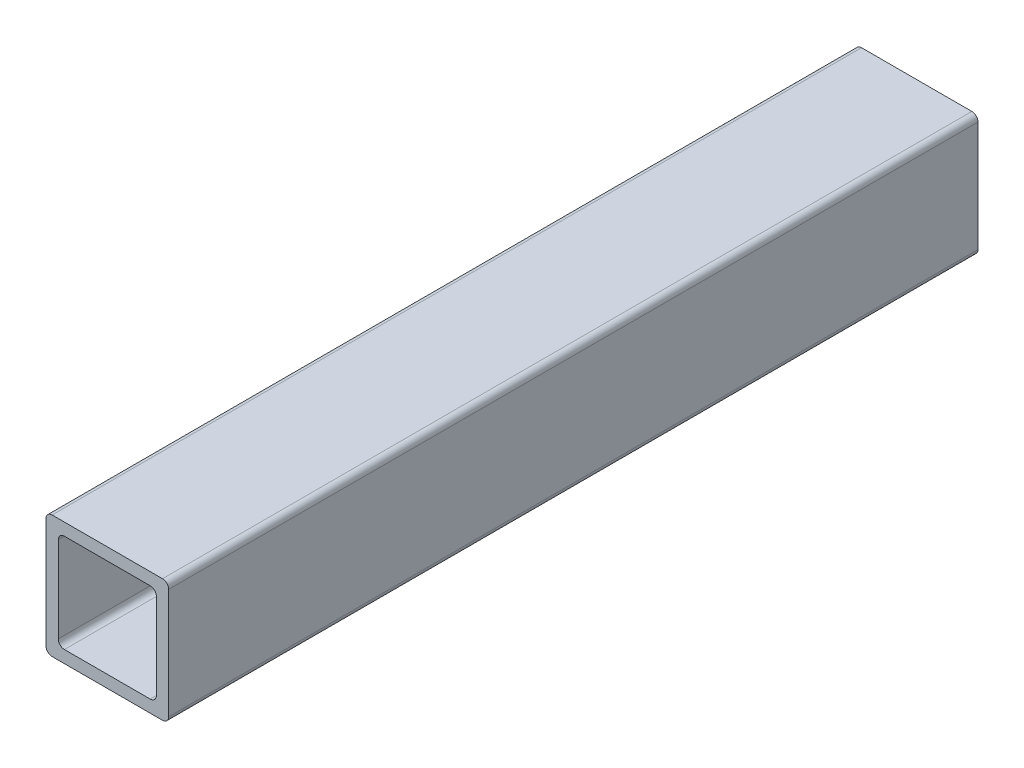
ISO-10303-21;
HEADER;
FILE_DESCRIPTION(('STEP AP214'),'2;1');
FILE_NAME('part.step','',(''),(''),'','','');
FILE_SCHEMA(('AUTOMOTIVE_DESIGN { 1 0 10303 214 1 1 1 1 }'));
ENDSEC;
DATA;
#1=APPLICATION_CONTEXT('core data for automotive mechanical design processes');
#2=APPLICATION_PROTOCOL_DEFINITION('international standard','automotive_design',2000,#1);
#3=PRODUCT_CONTEXT('',#1,'mechanical');
#4=PRODUCT('Part','Part','',(#3));
#5=PRODUCT_RELATED_PRODUCT_CATEGORY('part','',(#4));
#6=PRODUCT_DEFINITION_FORMATION('','',#4);
#7=PRODUCT_DEFINITION_CONTEXT('part definition',#1,'design');
#8=PRODUCT_DEFINITION('design','',#6,#7);
#9=PRODUCT_DEFINITION_SHAPE('','',#8);
#10=(LENGTH_UNIT() NAMED_UNIT(*) SI_UNIT(.MILLI.,.METRE.));
#11=(NAMED_UNIT(*) PLANE_ANGLE_UNIT() SI_UNIT($,.RADIAN.));
#12=(NAMED_UNIT(*) SI_UNIT($,.STERADIAN.) SOLID_ANGLE_UNIT());
#13=UNCERTAINTY_MEASURE_WITH_UNIT(LENGTH_MEASURE(1.E-05),#10,'distance_accuracy_value','');
#14=(GEOMETRIC_REPRESENTATION_CONTEXT(3) GLOBAL_UNCERTAINTY_ASSIGNED_CONTEXT((#13)) GLOBAL_UNIT_ASSIGNED_CONTEXT((#10,
#11,#12)) REPRESENTATION_CONTEXT('',''));
#15=CARTESIAN_POINT('',(0.,0.,0.));
#16=DIRECTION('',(0.,0.,1.));
#17=DIRECTION('',(1.,0.,0.));
#18=AXIS2_PLACEMENT_3D('',#15,#16,#17);
#19=CARTESIAN_POINT('',(2.,2.,264.));
#20=DIRECTION('',(0.,0.,-1.));
#21=DIRECTION('',(-1.,0.,0.));
#22=AXIS2_PLACEMENT_3D('',#19,#20,#21);
#23=PLANE('',#22);
#24=CARTESIAN_POINT('',(2.,2.,264.));
#25=DIRECTION('',(0.,0.,1.));
#26=DIRECTION('',(-1.,0.,0.));
#27=AXIS2_PLACEMENT_3D('',#24,#25,#26);
#28=CIRCLE('',#27,2.);
#29=CARTESIAN_POINT('',(0.,2.00000000000001,264.));
#30=VERTEX_POINT('',#29);
#31=CARTESIAN_POINT('',(2.00000000000001,0.,264.));
#32=VERTEX_POINT('',#31);
#33=EDGE_CURVE('E211',#30,#32,#28,.T.);
#34=ORIENTED_EDGE('',*,*,#33,.T.);
#35=DIRECTION('',(1.,0.,0.));
#36=VECTOR('',#35,1.);
#37=CARTESIAN_POINT('',(2.00000000000001,0.,264.));
#38=LINE('',#37,#36);
#39=CARTESIAN_POINT('',(38.,0.,264.));
#40=VERTEX_POINT('',#39);
#41=EDGE_CURVE('E214',#32,#40,#38,.T.);
#42=ORIENTED_EDGE('',*,*,#41,.T.);
#43=CARTESIAN_POINT('',(38.,2.,264.));
#44=DIRECTION('',(0.,0.,1.));
#45=DIRECTION('',(-1.,0.,0.));
#46=AXIS2_PLACEMENT_3D('',#43,#44,#45);
#47=CIRCLE('',#46,2.);
#48=CARTESIAN_POINT('',(40.,2.00000000000001,264.));
#49=VERTEX_POINT('',#48);
#50=EDGE_CURVE('E217',#40,#49,#47,.T.);
#51=ORIENTED_EDGE('',*,*,#50,.T.);
#52=DIRECTION('',(0.,1.,0.));
#53=VECTOR('',#52,1.);
#54=CARTESIAN_POINT('',(40.,2.00000000000001,264.));
#55=LINE('',#54,#53);
#56=CARTESIAN_POINT('',(40.,38.,264.));
#57=VERTEX_POINT('',#56);
#58=EDGE_CURVE('E219',#49,#57,#55,.T.);
#59=ORIENTED_EDGE('',*,*,#58,.T.);
#60=CARTESIAN_POINT('',(38.,38.,264.));
#61=DIRECTION('',(0.,0.,1.));
#62=DIRECTION('',(-1.,0.,0.));
#63=AXIS2_PLACEMENT_3D('',#60,#61,#62);
#64=CIRCLE('',#63,2.);
#65=CARTESIAN_POINT('',(38.,40.,264.));
#66=VERTEX_POINT('',#65);
#67=EDGE_CURVE('E221',#57,#66,#64,.T.);
#68=ORIENTED_EDGE('',*,*,#67,.T.);
#69=DIRECTION('',(-1.,0.,0.));
#70=VECTOR('',#69,1.);
#71=CARTESIAN_POINT('',(2.00000000000001,40.,264.));
#72=LINE('',#71,#70);
#73=CARTESIAN_POINT('',(2.00000000000001,40.,264.));
#74=VERTEX_POINT('',#73);
#75=EDGE_CURVE('E223',#66,#74,#72,.T.);
#76=ORIENTED_EDGE('',*,*,#75,.T.);
#77=CARTESIAN_POINT('',(2.,38.,264.));
#78=DIRECTION('',(0.,0.,1.));
#79=DIRECTION('',(-1.,0.,0.));
#80=AXIS2_PLACEMENT_3D('',#77,#78,#79);
#81=CIRCLE('',#80,2.);
#82=CARTESIAN_POINT('',(0.,38.,264.));
#83=VERTEX_POINT('',#82);
#84=EDGE_CURVE('E225',#74,#83,#81,.T.);
#85=ORIENTED_EDGE('',*,*,#84,.T.);
#86=DIRECTION('',(0.,-1.,0.));
#87=VECTOR('',#86,1.);
#88=CARTESIAN_POINT('',(0.,2.00000000000001,264.));
#89=LINE('',#88,#87);
#90=EDGE_CURVE('E227',#83,#30,#89,.T.);
#91=ORIENTED_EDGE('',*,*,#90,.T.);
#92=EDGE_LOOP('',(#34,#42,#51,#59,#68,#76,#85,#91));
#93=FACE_BOUND('',#92,.T.);
#94=CARTESIAN_POINT('',(34.,6.,264.));
#95=DIRECTION('',(0.,0.,1.));
#96=DIRECTION('',(1.,0.,0.));
#97=AXIS2_PLACEMENT_3D('',#94,#95,#96);
#98=CIRCLE('',#97,2.);
#99=CARTESIAN_POINT('',(34.,4.,264.));
#100=VERTEX_POINT('',#99);
#101=CARTESIAN_POINT('',(36.,6.00000000000001,264.));
#102=VERTEX_POINT('',#101);
#103=EDGE_CURVE('E146',#100,#102,#98,.T.);
#104=ORIENTED_EDGE('',*,*,#103,.F.);
#105=DIRECTION('',(1.,0.,0.));
#106=VECTOR('',#105,1.);
#107=CARTESIAN_POINT('',(6.00000000000001,4.,264.));
#108=LINE('',#107,#106);
#109=CARTESIAN_POINT('',(6.00000000000001,4.,264.));
#110=VERTEX_POINT('',#109);
#111=EDGE_CURVE('E179',#110,#100,#108,.T.);
#112=ORIENTED_EDGE('',*,*,#111,.F.);
#113=CARTESIAN_POINT('',(6.,6.,264.));
#114=DIRECTION('',(0.,0.,1.));
#115=DIRECTION('',(1.,0.,0.));
#116=AXIS2_PLACEMENT_3D('',#113,#114,#115);
#117=CIRCLE('',#116,2.);
#118=CARTESIAN_POINT('',(4.,6.00000000000001,264.));
#119=VERTEX_POINT('',#118);
#120=EDGE_CURVE('E177',#119,#110,#117,.T.);
#121=ORIENTED_EDGE('',*,*,#120,.F.);
#122=DIRECTION('',(0.,-1.,0.));
#123=VECTOR('',#122,1.);
#124=CARTESIAN_POINT('',(4.,6.00000000000001,264.));
#125=LINE('',#124,#123);
#126=CARTESIAN_POINT('',(4.,34.,264.));
#127=VERTEX_POINT('',#126);
#128=EDGE_CURVE('E175',#127,#119,#125,.T.);
#129=ORIENTED_EDGE('',*,*,#128,.F.);
#130=CARTESIAN_POINT('',(6.,34.,264.));
#131=DIRECTION('',(0.,0.,1.));
#132=DIRECTION('',(1.,0.,0.));
#133=AXIS2_PLACEMENT_3D('',#130,#131,#132);
#134=CIRCLE('',#133,2.);
#135=CARTESIAN_POINT('',(6.00000000000001,36.,264.));
#136=VERTEX_POINT('',#135);
#137=EDGE_CURVE('E173',#136,#127,#134,.T.);
#138=ORIENTED_EDGE('',*,*,#137,.F.);
#139=DIRECTION('',(-1.,0.,0.));
#140=VECTOR('',#139,1.);
#141=CARTESIAN_POINT('',(6.00000000000001,36.,264.));
#142=LINE('',#141,#140);
#143=CARTESIAN_POINT('',(34.,36.,264.));
#144=VERTEX_POINT('',#143);
#145=EDGE_CURVE('E169',#144,#136,#142,.T.);
#146=ORIENTED_EDGE('',*,*,#145,.F.);
#147=CARTESIAN_POINT('',(34.,34.,264.));
#148=DIRECTION('',(0.,0.,1.));
#149=DIRECTION('',(1.,0.,0.));
#150=AXIS2_PLACEMENT_3D('',#147,#148,#149);
#151=CIRCLE('',#150,2.);
#152=CARTESIAN_POINT('',(36.,34.,264.));
#153=VERTEX_POINT('',#152);
#154=EDGE_CURVE('E167',#153,#144,#151,.T.);
#155=ORIENTED_EDGE('',*,*,#154,.F.);
#156=DIRECTION('',(0.,1.,0.));
#157=VECTOR('',#156,1.);
#158=CARTESIAN_POINT('',(36.,6.00000000000001,264.));
#159=LINE('',#158,#157);
#160=EDGE_CURVE('E154',#102,#153,#159,.T.);
#161=ORIENTED_EDGE('',*,*,#160,.F.);
#162=EDGE_LOOP('',(#104,#112,#121,#129,#138,#146,#155,#161));
#163=FACE_BOUND('',#162,.T.);
#164=ADVANCED_FACE('F33',(#93,#163),#23,.F.);
#165=CARTESIAN_POINT('',(2.,2.,0.));
#166=DIRECTION('',(0.,0.,-1.));
#167=DIRECTION('',(-1.,0.,0.));
#168=AXIS2_PLACEMENT_3D('',#165,#166,#167);
#169=PLANE('',#168);
#170=CARTESIAN_POINT('',(2.,2.,0.));
#171=DIRECTION('',(0.,0.,1.));
#172=DIRECTION('',(-1.,0.,0.));
#173=AXIS2_PLACEMENT_3D('',#170,#171,#172);
#174=CIRCLE('',#173,2.);
#175=CARTESIAN_POINT('',(0.,2.00000000000001,0.));
#176=VERTEX_POINT('',#175);
#177=CARTESIAN_POINT('',(2.00000000000001,0.,0.));
#178=VERTEX_POINT('',#177);
#179=EDGE_CURVE('E162',#176,#178,#174,.T.);
#180=ORIENTED_EDGE('',*,*,#179,.F.);
#181=DIRECTION('',(0.,-1.,0.));
#182=VECTOR('',#181,1.);
#183=CARTESIAN_POINT('',(0.,2.00000000000001,0.));
#184=LINE('',#183,#182);
#185=CARTESIAN_POINT('',(0.,38.,0.));
#186=VERTEX_POINT('',#185);
#187=EDGE_CURVE('E215',#186,#176,#184,.T.);
#188=ORIENTED_EDGE('',*,*,#187,.F.);
#189=CARTESIAN_POINT('',(2.,38.,0.));
#190=DIRECTION('',(0.,0.,1.));
#191=DIRECTION('',(-1.,0.,0.));
#192=AXIS2_PLACEMENT_3D('',#189,#190,#191);
#193=CIRCLE('',#192,2.);
#194=CARTESIAN_POINT('',(2.00000000000001,40.,0.));
#195=VERTEX_POINT('',#194);
#196=EDGE_CURVE('E242',#195,#186,#193,.T.);
#197=ORIENTED_EDGE('',*,*,#196,.F.);
#198=DIRECTION('',(-1.,0.,0.));
#199=VECTOR('',#198,1.);
#200=CARTESIAN_POINT('',(2.00000000000001,40.,0.));
#201=LINE('',#200,#199);
#202=CARTESIAN_POINT('',(38.,40.,0.));
#203=VERTEX_POINT('',#202);
#204=EDGE_CURVE('E240',#203,#195,#201,.T.);
#205=ORIENTED_EDGE('',*,*,#204,.F.);
#206=CARTESIAN_POINT('',(38.,38.,0.));
#207=DIRECTION('',(0.,0.,1.));
#208=DIRECTION('',(-1.,0.,0.));
#209=AXIS2_PLACEMENT_3D('',#206,#207,#208);
#210=CIRCLE('',#209,2.);
#211=CARTESIAN_POINT('',(40.,38.,0.));
#212=VERTEX_POINT('',#211);
#213=EDGE_CURVE('E238',#212,#203,#210,.T.);
#214=ORIENTED_EDGE('',*,*,#213,.F.);
#215=DIRECTION('',(0.,1.,0.));
#216=VECTOR('',#215,1.);
#217=CARTESIAN_POINT('',(40.,2.00000000000001,0.));
#218=LINE('',#217,#216);
#219=CARTESIAN_POINT('',(40.,2.00000000000001,0.));
#220=VERTEX_POINT('',#219);
#221=EDGE_CURVE('E236',#220,#212,#218,.T.);
#222=ORIENTED_EDGE('',*,*,#221,.F.);
#223=CARTESIAN_POINT('',(38.,2.,0.));
#224=DIRECTION('',(0.,0.,1.));
#225=DIRECTION('',(-1.,0.,0.));
#226=AXIS2_PLACEMENT_3D('',#223,#224,#225);
#227=CIRCLE('',#226,2.);
#228=CARTESIAN_POINT('',(38.,0.,0.));
#229=VERTEX_POINT('',#228);
#230=EDGE_CURVE('E234',#229,#220,#227,.T.);
#231=ORIENTED_EDGE('',*,*,#230,.F.);
#232=DIRECTION('',(1.,0.,0.));
#233=VECTOR('',#232,1.);
#234=CARTESIAN_POINT('',(2.00000000000001,0.,0.));
#235=LINE('',#234,#233);
#236=EDGE_CURVE('E232',#178,#229,#235,.T.);
#237=ORIENTED_EDGE('',*,*,#236,.F.);
#238=EDGE_LOOP('',(#180,#188,#197,#205,#214,#222,#231,#237));
#239=FACE_BOUND('',#238,.T.);
#240=DIRECTION('',(1.,0.,0.));
#241=VECTOR('',#240,1.);
#242=CARTESIAN_POINT('',(6.00000000000001,4.,0.));
#243=LINE('',#242,#241);
#244=CARTESIAN_POINT('',(6.00000000000001,4.,0.));
#245=VERTEX_POINT('',#244);
#246=CARTESIAN_POINT('',(34.,4.,0.));
#247=VERTEX_POINT('',#246);
#248=EDGE_CURVE('E155',#245,#247,#243,.T.);
#249=ORIENTED_EDGE('',*,*,#248,.T.);
#250=CARTESIAN_POINT('',(34.,6.,0.));
#251=DIRECTION('',(0.,0.,1.));
#252=DIRECTION('',(1.,0.,0.));
#253=AXIS2_PLACEMENT_3D('',#250,#251,#252);
#254=CIRCLE('',#253,2.);
#255=CARTESIAN_POINT('',(36.,6.00000000000001,0.));
#256=VERTEX_POINT('',#255);
#257=EDGE_CURVE('E56',#247,#256,#254,.T.);
#258=ORIENTED_EDGE('',*,*,#257,.T.);
#259=DIRECTION('',(0.,1.,0.));
#260=VECTOR('',#259,1.);
#261=CARTESIAN_POINT('',(36.,6.00000000000001,0.));
#262=LINE('',#261,#260);
#263=CARTESIAN_POINT('',(36.,34.,0.));
#264=VERTEX_POINT('',#263);
#265=EDGE_CURVE('E161',#256,#264,#262,.T.);
#266=ORIENTED_EDGE('',*,*,#265,.T.);
#267=CARTESIAN_POINT('',(34.,34.,0.));
#268=DIRECTION('',(0.,0.,1.));
#269=DIRECTION('',(1.,0.,0.));
#270=AXIS2_PLACEMENT_3D('',#267,#268,#269);
#271=CIRCLE('',#270,2.);
#272=CARTESIAN_POINT('',(34.,36.,0.));
#273=VERTEX_POINT('',#272);
#274=EDGE_CURVE('E183',#264,#273,#271,.T.);
#275=ORIENTED_EDGE('',*,*,#274,.T.);
#276=DIRECTION('',(-1.,0.,0.));
#277=VECTOR('',#276,1.);
#278=CARTESIAN_POINT('',(6.00000000000001,36.,0.));
#279=LINE('',#278,#277);
#280=CARTESIAN_POINT('',(6.00000000000001,36.,0.));
#281=VERTEX_POINT('',#280);
#282=EDGE_CURVE('E186',#273,#281,#279,.T.);
#283=ORIENTED_EDGE('',*,*,#282,.T.);
#284=CARTESIAN_POINT('',(6.,34.,0.));
#285=DIRECTION('',(0.,0.,1.));
#286=DIRECTION('',(1.,0.,0.));
#287=AXIS2_PLACEMENT_3D('',#284,#285,#286);
#288=CIRCLE('',#287,2.);
#289=CARTESIAN_POINT('',(4.,34.,0.));
#290=VERTEX_POINT('',#289);
#291=EDGE_CURVE('E189',#281,#290,#288,.T.);
#292=ORIENTED_EDGE('',*,*,#291,.T.);
#293=DIRECTION('',(0.,-1.,0.));
#294=VECTOR('',#293,1.);
#295=CARTESIAN_POINT('',(4.,6.00000000000001,0.));
#296=LINE('',#295,#294);
#297=CARTESIAN_POINT('',(4.,6.00000000000001,0.));
#298=VERTEX_POINT('',#297);
#299=EDGE_CURVE('E192',#290,#298,#296,.T.);
#300=ORIENTED_EDGE('',*,*,#299,.T.);
#301=CARTESIAN_POINT('',(6.,6.,0.));
#302=DIRECTION('',(0.,0.,1.));
#303=DIRECTION('',(1.,0.,0.));
#304=AXIS2_PLACEMENT_3D('',#301,#302,#303);
#305=CIRCLE('',#304,2.);
#306=EDGE_CURVE('E195',#298,#245,#305,.T.);
#307=ORIENTED_EDGE('',*,*,#306,.T.);
#308=EDGE_LOOP('',(#249,#258,#266,#275,#283,#292,#300,#307));
#309=FACE_BOUND('',#308,.T.);
#310=ADVANCED_FACE('F272',(#239,#309),#169,.T.);
#311=CARTESIAN_POINT('',(2.,2.,264.));
#312=DIRECTION('',(0.,0.,-1.));
#313=DIRECTION('',(-1.,0.,0.));
#314=AXIS2_PLACEMENT_3D('',#311,#312,#313);
#315=CYLINDRICAL_SURFACE('',#314,2.);
#316=ORIENTED_EDGE('',*,*,#179,.T.);
#317=DIRECTION('',(0.,0.,-1.));
#318=VECTOR('',#317,1.);
#319=CARTESIAN_POINT('',(2.00000000000001,0.,264.));
#320=LINE('',#319,#318);
#321=EDGE_CURVE('E11',#32,#178,#320,.T.);
#322=ORIENTED_EDGE('',*,*,#321,.F.);
#323=ORIENTED_EDGE('',*,*,#33,.F.);
#324=DIRECTION('',(0.,0.,-1.));
#325=VECTOR('',#324,1.);
#326=CARTESIAN_POINT('',(0.,2.00000000000001,264.));
#327=LINE('',#326,#325);
#328=EDGE_CURVE('E229',#30,#176,#327,.T.);
#329=ORIENTED_EDGE('',*,*,#328,.T.);
#330=EDGE_LOOP('',(#316,#322,#323,#329));
#331=FACE_BOUND('',#330,.T.);
#332=ADVANCED_FACE('F35',(#331),#315,.T.);
#333=CARTESIAN_POINT('',(2.00000000000001,0.,264.));
#334=DIRECTION('',(0.,1.,0.));
#335=DIRECTION('',(0.,0.,1.));
#336=AXIS2_PLACEMENT_3D('',#333,#334,#335);
#337=PLANE('',#336);
#338=ORIENTED_EDGE('',*,*,#236,.T.);
#339=DIRECTION('',(0.,0.,-1.));
#340=VECTOR('',#339,1.);
#341=CARTESIAN_POINT('',(38.,0.,264.));
#342=LINE('',#341,#340);
#343=EDGE_CURVE('E41',#40,#229,#342,.T.);
#344=ORIENTED_EDGE('',*,*,#343,.F.);
#345=ORIENTED_EDGE('',*,*,#41,.F.);
#346=ORIENTED_EDGE('',*,*,#321,.T.);
#347=EDGE_LOOP('',(#338,#344,#345,#346));
#348=FACE_BOUND('',#347,.T.);
#349=ADVANCED_FACE('F289',(#348),#337,.F.);
#350=CARTESIAN_POINT('',(38.,2.,264.));
#351=DIRECTION('',(0.,0.,-1.));
#352=DIRECTION('',(-1.,0.,0.));
#353=AXIS2_PLACEMENT_3D('',#350,#351,#352);
#354=CYLINDRICAL_SURFACE('',#353,2.);
#355=ORIENTED_EDGE('',*,*,#230,.T.);
#356=DIRECTION('',(0.,0.,-1.));
#357=VECTOR('',#356,1.);
#358=CARTESIAN_POINT('',(40.,2.00000000000001,264.));
#359=LINE('',#358,#357);
#360=EDGE_CURVE('E259',#49,#220,#359,.T.);
#361=ORIENTED_EDGE('',*,*,#360,.F.);
#362=ORIENTED_EDGE('',*,*,#50,.F.);
#363=ORIENTED_EDGE('',*,*,#343,.T.);
#364=EDGE_LOOP('',(#355,#361,#362,#363));
#365=FACE_BOUND('',#364,.T.);
#366=ADVANCED_FACE('F266',(#365),#354,.T.);
#367=CARTESIAN_POINT('',(40.,2.00000000000001,264.));
#368=DIRECTION('',(-1.,0.,0.));
#369=DIRECTION('',(0.,0.,1.));
#370=AXIS2_PLACEMENT_3D('',#367,#368,#369);
#371=PLANE('',#370);
#372=ORIENTED_EDGE('',*,*,#221,.T.);
#373=DIRECTION('',(0.,0.,-1.));
#374=VECTOR('',#373,1.);
#375=CARTESIAN_POINT('',(40.,38.,264.));
#376=LINE('',#375,#374);
#377=EDGE_CURVE('E256',#57,#212,#376,.T.);
#378=ORIENTED_EDGE('',*,*,#377,.F.);
#379=ORIENTED_EDGE('',*,*,#58,.F.);
#380=ORIENTED_EDGE('',*,*,#360,.T.);
#381=EDGE_LOOP('',(#372,#378,#379,#380));
#382=FACE_BOUND('',#381,.T.);
#383=ADVANCED_FACE('F278',(#382),#371,.F.);
#384=CARTESIAN_POINT('',(38.,38.,264.));
#385=DIRECTION('',(0.,0.,-1.));
#386=DIRECTION('',(-1.,0.,0.));
#387=AXIS2_PLACEMENT_3D('',#384,#385,#386);
#388=CYLINDRICAL_SURFACE('',#387,2.);
#389=ORIENTED_EDGE('',*,*,#213,.T.);
#390=DIRECTION('',(0.,0.,-1.));
#391=VECTOR('',#390,1.);
#392=CARTESIAN_POINT('',(38.,40.,264.));
#393=LINE('',#392,#391);
#394=EDGE_CURVE('E253',#66,#203,#393,.T.);
#395=ORIENTED_EDGE('',*,*,#394,.F.);
#396=ORIENTED_EDGE('',*,*,#67,.F.);
#397=ORIENTED_EDGE('',*,*,#377,.T.);
#398=EDGE_LOOP('',(#389,#395,#396,#397));
#399=FACE_BOUND('',#398,.T.);
#400=ADVANCED_FACE('F282',(#399),#388,.T.);
#401=CARTESIAN_POINT('',(2.00000000000001,40.,264.));
#402=DIRECTION('',(0.,-1.,0.));
#403=DIRECTION('',(0.,0.,-1.));
#404=AXIS2_PLACEMENT_3D('',#401,#402,#403);
#405=PLANE('',#404);
#406=ORIENTED_EDGE('',*,*,#204,.T.);
#407=DIRECTION('',(0.,0.,-1.));
#408=VECTOR('',#407,1.);
#409=CARTESIAN_POINT('',(2.00000000000001,40.,264.));
#410=LINE('',#409,#408);
#411=EDGE_CURVE('E250',#74,#195,#410,.T.);
#412=ORIENTED_EDGE('',*,*,#411,.F.);
#413=ORIENTED_EDGE('',*,*,#75,.F.);
#414=ORIENTED_EDGE('',*,*,#394,.T.);
#415=EDGE_LOOP('',(#406,#412,#413,#414));
#416=FACE_BOUND('',#415,.T.);
#417=ADVANCED_FACE('F302',(#416),#405,.F.);
#418=CARTESIAN_POINT('',(2.,38.,264.));
#419=DIRECTION('',(0.,0.,-1.));
#420=DIRECTION('',(-1.,0.,0.));
#421=AXIS2_PLACEMENT_3D('',#418,#419,#420);
#422=CYLINDRICAL_SURFACE('',#421,2.);
#423=ORIENTED_EDGE('',*,*,#196,.T.);
#424=DIRECTION('',(0.,0.,-1.));
#425=VECTOR('',#424,1.);
#426=CARTESIAN_POINT('',(0.,38.,264.));
#427=LINE('',#426,#425);
#428=EDGE_CURVE('E247',#83,#186,#427,.T.);
#429=ORIENTED_EDGE('',*,*,#428,.F.);
#430=ORIENTED_EDGE('',*,*,#84,.F.);
#431=ORIENTED_EDGE('',*,*,#411,.T.);
#432=EDGE_LOOP('',(#423,#429,#430,#431));
#433=FACE_BOUND('',#432,.T.);
#434=ADVANCED_FACE('F300',(#433),#422,.T.);
#435=CARTESIAN_POINT('',(0.,2.00000000000001,264.));
#436=DIRECTION('',(1.,0.,0.));
#437=DIRECTION('',(0.,0.,-1.));
#438=AXIS2_PLACEMENT_3D('',#435,#436,#437);
#439=PLANE('',#438);
#440=ORIENTED_EDGE('',*,*,#187,.T.);
#441=ORIENTED_EDGE('',*,*,#328,.F.);
#442=ORIENTED_EDGE('',*,*,#90,.F.);
#443=ORIENTED_EDGE('',*,*,#428,.T.);
#444=EDGE_LOOP('',(#440,#441,#442,#443));
#445=FACE_BOUND('',#444,.T.);
#446=ADVANCED_FACE('F295',(#445),#439,.F.);
#447=CARTESIAN_POINT('',(34.,6.,264.));
#448=DIRECTION('',(0.,0.,-1.));
#449=DIRECTION('',(-1.,0.,0.));
#450=AXIS2_PLACEMENT_3D('',#447,#448,#449);
#451=CYLINDRICAL_SURFACE('',#450,2.);
#452=ORIENTED_EDGE('',*,*,#257,.F.);
#453=DIRECTION('',(0.,0.,-1.));
#454=VECTOR('',#453,1.);
#455=CARTESIAN_POINT('',(34.,4.,264.));
#456=LINE('',#455,#454);
#457=EDGE_CURVE('E150',#100,#247,#456,.T.);
#458=ORIENTED_EDGE('',*,*,#457,.F.);
#459=ORIENTED_EDGE('',*,*,#103,.T.);
#460=DIRECTION('',(0.,0.,-1.));
#461=VECTOR('',#460,1.);
#462=CARTESIAN_POINT('',(36.,6.00000000000001,264.));
#463=LINE('',#462,#461);
#464=EDGE_CURVE('E149',#102,#256,#463,.T.);
#465=ORIENTED_EDGE('',*,*,#464,.T.);
#466=EDGE_LOOP('',(#452,#458,#459,#465));
#467=FACE_BOUND('',#466,.T.);
#468=ADVANCED_FACE('F148',(#467),#451,.F.);
#469=CARTESIAN_POINT('',(36.,6.00000000000001,264.));
#470=DIRECTION('',(-1.,0.,0.));
#471=DIRECTION('',(0.,0.,1.));
#472=AXIS2_PLACEMENT_3D('',#469,#470,#471);
#473=PLANE('',#472);
#474=ORIENTED_EDGE('',*,*,#265,.F.);
#475=ORIENTED_EDGE('',*,*,#464,.F.);
#476=ORIENTED_EDGE('',*,*,#160,.T.);
#477=DIRECTION('',(0.,0.,-1.));
#478=VECTOR('',#477,1.);
#479=CARTESIAN_POINT('',(36.,34.,264.));
#480=LINE('',#479,#478);
#481=EDGE_CURVE('E163',#153,#264,#480,.T.);
#482=ORIENTED_EDGE('',*,*,#481,.T.);
#483=EDGE_LOOP('',(#474,#475,#476,#482));
#484=FACE_BOUND('',#483,.T.);
#485=ADVANCED_FACE('F158',(#484),#473,.T.);
#486=CARTESIAN_POINT('',(34.,34.,264.));
#487=DIRECTION('',(0.,0.,-1.));
#488=DIRECTION('',(-1.,0.,0.));
#489=AXIS2_PLACEMENT_3D('',#486,#487,#488);
#490=CYLINDRICAL_SURFACE('',#489,2.);
#491=ORIENTED_EDGE('',*,*,#274,.F.);
#492=ORIENTED_EDGE('',*,*,#481,.F.);
#493=ORIENTED_EDGE('',*,*,#154,.T.);
#494=DIRECTION('',(0.,0.,-1.));
#495=VECTOR('',#494,1.);
#496=CARTESIAN_POINT('',(34.,36.,264.));
#497=LINE('',#496,#495);
#498=EDGE_CURVE('E208',#144,#273,#497,.T.);
#499=ORIENTED_EDGE('',*,*,#498,.T.);
#500=EDGE_LOOP('',(#491,#492,#493,#499));
#501=FACE_BOUND('',#500,.T.);
#502=ADVANCED_FACE('F327',(#501),#490,.F.);
#503=CARTESIAN_POINT('',(6.00000000000001,36.,264.));
#504=DIRECTION('',(0.,-1.,0.));
#505=DIRECTION('',(0.,0.,-1.));
#506=AXIS2_PLACEMENT_3D('',#503,#504,#505);
#507=PLANE('',#506);
#508=ORIENTED_EDGE('',*,*,#282,.F.);
#509=ORIENTED_EDGE('',*,*,#498,.F.);
#510=ORIENTED_EDGE('',*,*,#145,.T.);
#511=DIRECTION('',(0.,0.,-1.));
#512=VECTOR('',#511,1.);
#513=CARTESIAN_POINT('',(6.00000000000001,36.,264.));
#514=LINE('',#513,#512);
#515=EDGE_CURVE('E206',#136,#281,#514,.T.);
#516=ORIENTED_EDGE('',*,*,#515,.T.);
#517=EDGE_LOOP('',(#508,#509,#510,#516));
#518=FACE_BOUND('',#517,.T.);
#519=ADVANCED_FACE('F331',(#518),#507,.T.);
#520=CARTESIAN_POINT('',(6.,34.,264.));
#521=DIRECTION('',(0.,0.,-1.));
#522=DIRECTION('',(-1.,0.,0.));
#523=AXIS2_PLACEMENT_3D('',#520,#521,#522);
#524=CYLINDRICAL_SURFACE('',#523,2.);
#525=ORIENTED_EDGE('',*,*,#291,.F.);
#526=ORIENTED_EDGE('',*,*,#515,.F.);
#527=ORIENTED_EDGE('',*,*,#137,.T.);
#528=DIRECTION('',(0.,0.,-1.));
#529=VECTOR('',#528,1.);
#530=CARTESIAN_POINT('',(4.,34.,264.));
#531=LINE('',#530,#529);
#532=EDGE_CURVE('E204',#127,#290,#531,.T.);
#533=ORIENTED_EDGE('',*,*,#532,.T.);
#534=EDGE_LOOP('',(#525,#526,#527,#533));
#535=FACE_BOUND('',#534,.T.);
#536=ADVANCED_FACE('F337',(#535),#524,.F.);
#537=CARTESIAN_POINT('',(4.,6.00000000000001,264.));
#538=DIRECTION('',(1.,0.,0.));
#539=DIRECTION('',(0.,0.,-1.));
#540=AXIS2_PLACEMENT_3D('',#537,#538,#539);
#541=PLANE('',#540);
#542=ORIENTED_EDGE('',*,*,#299,.F.);
#543=ORIENTED_EDGE('',*,*,#532,.F.);
#544=ORIENTED_EDGE('',*,*,#128,.T.);
#545=DIRECTION('',(0.,0.,-1.));
#546=VECTOR('',#545,1.);
#547=CARTESIAN_POINT('',(4.,6.00000000000001,264.));
#548=LINE('',#547,#546);
#549=EDGE_CURVE('E202',#119,#298,#548,.T.);
#550=ORIENTED_EDGE('',*,*,#549,.T.);
#551=EDGE_LOOP('',(#542,#543,#544,#550));
#552=FACE_BOUND('',#551,.T.);
#553=ADVANCED_FACE('F341',(#552),#541,.T.);
#554=CARTESIAN_POINT('',(6.,6.,264.));
#555=DIRECTION('',(0.,0.,-1.));
#556=DIRECTION('',(-1.,0.,0.));
#557=AXIS2_PLACEMENT_3D('',#554,#555,#556);
#558=CYLINDRICAL_SURFACE('',#557,2.);
#559=ORIENTED_EDGE('',*,*,#306,.F.);
#560=ORIENTED_EDGE('',*,*,#549,.F.);
#561=ORIENTED_EDGE('',*,*,#120,.T.);
#562=DIRECTION('',(0.,0.,-1.));
#563=VECTOR('',#562,1.);
#564=CARTESIAN_POINT('',(6.00000000000001,4.,264.));
#565=LINE('',#564,#563);
#566=EDGE_CURVE('E48',#110,#245,#565,.T.);
#567=ORIENTED_EDGE('',*,*,#566,.T.);
#568=EDGE_LOOP('',(#559,#560,#561,#567));
#569=FACE_BOUND('',#568,.T.);
#570=ADVANCED_FACE('F345',(#569),#558,.F.);
#571=CARTESIAN_POINT('',(6.00000000000001,4.,264.));
#572=DIRECTION('',(0.,1.,0.));
#573=DIRECTION('',(0.,0.,1.));
#574=AXIS2_PLACEMENT_3D('',#571,#572,#573);
#575=PLANE('',#574);
#576=ORIENTED_EDGE('',*,*,#248,.F.);
#577=ORIENTED_EDGE('',*,*,#566,.F.);
#578=ORIENTED_EDGE('',*,*,#111,.T.);
#579=ORIENTED_EDGE('',*,*,#457,.T.);
#580=EDGE_LOOP('',(#576,#577,#578,#579));
#581=FACE_BOUND('',#580,.T.);
#582=ADVANCED_FACE('F349',(#581),#575,.T.);
#583=CLOSED_SHELL('',(#164,#310,#332,#349,#366,#383,#400,#417,#434,#446,#468,#485,#502,#519,
#536,#553,#570,#582));
#584=MANIFOLD_SOLID_BREP('B2',#583);
#585=ADVANCED_BREP_SHAPE_REPRESENTATION('',(#18,#584),#14);
#586=SHAPE_DEFINITION_REPRESENTATION(#9,#585);
ENDSEC;
END-ISO-10303-21;
